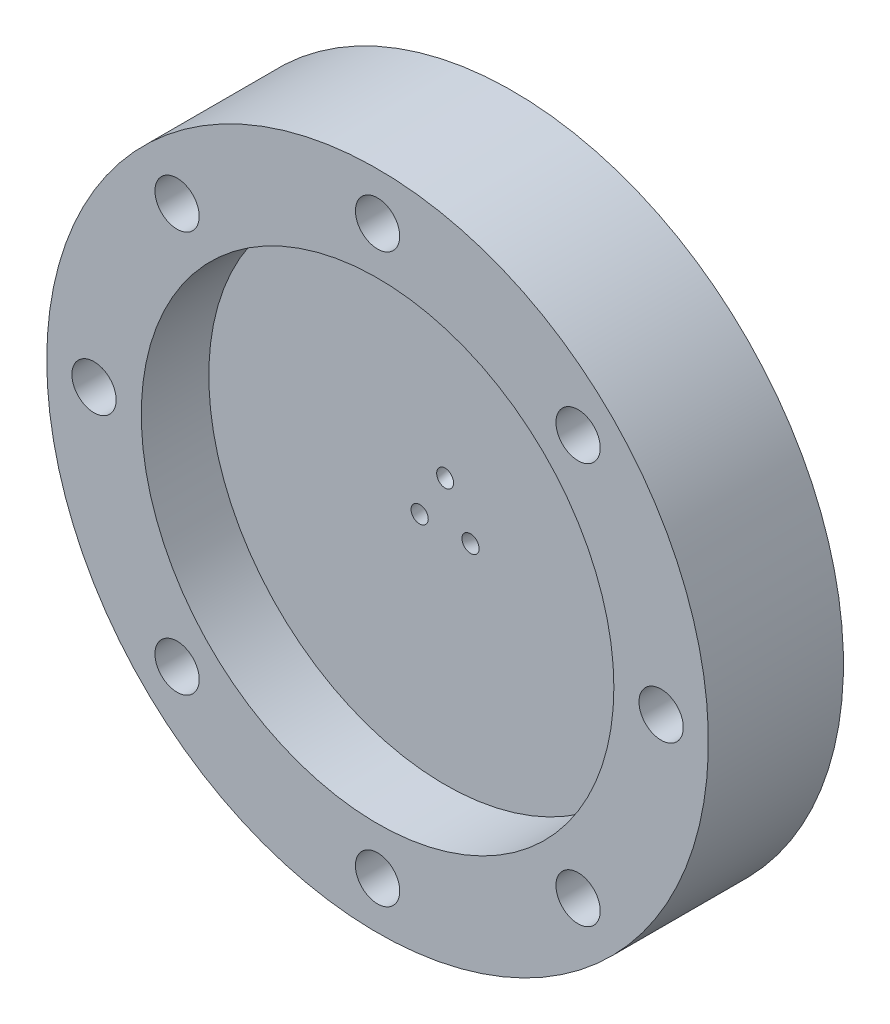
ISO-10303-21;
HEADER;
FILE_DESCRIPTION(('STEP AP214'),'2;1');
FILE_NAME('part.step','',(''),(''),'','','');
FILE_SCHEMA(('AUTOMOTIVE_DESIGN { 1 0 10303 214 1 1 1 1 }'));
ENDSEC;
DATA;
#1=APPLICATION_CONTEXT('core data for automotive mechanical design processes');
#2=APPLICATION_PROTOCOL_DEFINITION('international standard','automotive_design',2000,#1);
#3=PRODUCT_CONTEXT('',#1,'mechanical');
#4=PRODUCT('Part','Part','',(#3));
#5=PRODUCT_RELATED_PRODUCT_CATEGORY('part','',(#4));
#6=PRODUCT_DEFINITION_FORMATION('','',#4);
#7=PRODUCT_DEFINITION_CONTEXT('part definition',#1,'design');
#8=PRODUCT_DEFINITION('design','',#6,#7);
#9=PRODUCT_DEFINITION_SHAPE('','',#8);
#10=(LENGTH_UNIT() NAMED_UNIT(*) SI_UNIT(.MILLI.,.METRE.));
#11=(NAMED_UNIT(*) PLANE_ANGLE_UNIT() SI_UNIT($,.RADIAN.));
#12=(NAMED_UNIT(*) SI_UNIT($,.STERADIAN.) SOLID_ANGLE_UNIT());
#13=UNCERTAINTY_MEASURE_WITH_UNIT(LENGTH_MEASURE(1.E-05),#10,'distance_accuracy_value','');
#14=(GEOMETRIC_REPRESENTATION_CONTEXT(3) GLOBAL_UNCERTAINTY_ASSIGNED_CONTEXT((#13)) GLOBAL_UNIT_ASSIGNED_CONTEXT((#10,
#11,#12)) REPRESENTATION_CONTEXT('',''));
#15=CARTESIAN_POINT('',(0.,0.,0.));
#16=DIRECTION('',(0.,0.,1.));
#17=DIRECTION('',(1.,0.,0.));
#18=AXIS2_PLACEMENT_3D('',#15,#16,#17);
#19=CARTESIAN_POINT('',(0.,0.,-14.413089350023));
#20=DIRECTION('',(0.,0.,1.));
#21=DIRECTION('',(1.,0.,0.));
#22=AXIS2_PLACEMENT_3D('',#19,#20,#21);
#23=CYLINDRICAL_SURFACE('',#22,31.115);
#24=CARTESIAN_POINT('',(0.,0.,-14.413089350023));
#25=DIRECTION('',(0.,0.,-1.));
#26=DIRECTION('',(-1.,0.,0.));
#27=AXIS2_PLACEMENT_3D('',#24,#25,#26);
#28=CIRCLE('',#27,31.115);
#29=CARTESIAN_POINT('',(-31.115,0.,-14.413089350023));
#30=VERTEX_POINT('',#29);
#31=EDGE_CURVE('E10',#30,#30,#28,.T.);
#32=ORIENTED_EDGE('',*,*,#31,.F.);
#33=EDGE_LOOP('',(#32));
#34=FACE_BOUND('',#33,.T.);
#35=CARTESIAN_POINT('',(0.,0.,-1.71308935002297));
#36=DIRECTION('',(0.,0.,-1.));
#37=DIRECTION('',(-1.,0.,0.));
#38=AXIS2_PLACEMENT_3D('',#35,#36,#37);
#39=CIRCLE('',#38,31.115);
#40=CARTESIAN_POINT('',(-31.115,0.,-1.71308935002297));
#41=VERTEX_POINT('',#40);
#42=EDGE_CURVE('E43',#41,#41,#39,.T.);
#43=ORIENTED_EDGE('',*,*,#42,.T.);
#44=EDGE_LOOP('',(#43));
#45=FACE_BOUND('',#44,.T.);
#46=ADVANCED_FACE('F40',(#34,#45),#23,.T.);
#47=CARTESIAN_POINT('',(0.,0.,-14.413089350023));
#48=DIRECTION('',(0.,0.,-1.));
#49=DIRECTION('',(-1.,0.,0.));
#50=AXIS2_PLACEMENT_3D('',#47,#48,#49);
#51=PLANE('',#50);
#52=CARTESIAN_POINT('',(0.,0.,-14.413089350023));
#53=DIRECTION('',(0.,0.,1.));
#54=DIRECTION('',(1.,0.,0.));
#55=AXIS2_PLACEMENT_3D('',#52,#53,#54);
#56=CIRCLE('',#55,2.08279999999999);
#57=CARTESIAN_POINT('',(2.08279999999999,0.,-14.413089350023));
#58=VERTEX_POINT('',#57);
#59=EDGE_CURVE('E114',#58,#58,#56,.T.);
#60=ORIENTED_EDGE('',*,*,#59,.T.);
#61=EDGE_LOOP('',(#60));
#62=FACE_BOUND('',#61,.T.);
#63=CARTESIAN_POINT('',(0.,26.67,-14.413089350023));
#64=DIRECTION('',(0.,0.,-1.));
#65=DIRECTION('',(-1.,0.,0.));
#66=AXIS2_PLACEMENT_3D('',#63,#64,#65);
#67=CIRCLE('',#66,2.0828);
#68=CARTESIAN_POINT('',(-2.0828,26.67,-14.413089350023));
#69=VERTEX_POINT('',#68);
#70=EDGE_CURVE('E93',#69,#69,#67,.T.);
#71=ORIENTED_EDGE('',*,*,#70,.F.);
#72=EDGE_LOOP('',(#71));
#73=FACE_BOUND('',#72,.T.);
#74=CARTESIAN_POINT('',(-18.8585378542452,18.8585378542452,-14.413089350023));
#75=DIRECTION('',(0.,0.,-1.));
#76=DIRECTION('',(-1.,0.,0.));
#77=AXIS2_PLACEMENT_3D('',#74,#75,#76);
#78=CIRCLE('',#77,2.0828);
#79=CARTESIAN_POINT('',(-20.9413378542452,18.8585378542452,-14.413089350023));
#80=VERTEX_POINT('',#79);
#81=EDGE_CURVE('E90',#80,#80,#78,.T.);
#82=ORIENTED_EDGE('',*,*,#81,.F.);
#83=EDGE_LOOP('',(#82));
#84=FACE_BOUND('',#83,.T.);
#85=CARTESIAN_POINT('',(-26.67,0.,-14.413089350023));
#86=DIRECTION('',(0.,0.,-1.));
#87=DIRECTION('',(-1.,0.,0.));
#88=AXIS2_PLACEMENT_3D('',#85,#86,#87);
#89=CIRCLE('',#88,2.0828);
#90=CARTESIAN_POINT('',(-28.7528,0.,-14.413089350023));
#91=VERTEX_POINT('',#90);
#92=EDGE_CURVE('E84',#91,#91,#89,.T.);
#93=ORIENTED_EDGE('',*,*,#92,.F.);
#94=EDGE_LOOP('',(#93));
#95=FACE_BOUND('',#94,.T.);
#96=CARTESIAN_POINT('',(-18.8585378542452,-18.8585378542452,-14.413089350023));
#97=DIRECTION('',(0.,0.,-1.));
#98=DIRECTION('',(-1.,0.,0.));
#99=AXIS2_PLACEMENT_3D('',#96,#97,#98);
#100=CIRCLE('',#99,2.0828);
#101=CARTESIAN_POINT('',(-20.9413378542452,-18.8585378542452,-14.413089350023));
#102=VERTEX_POINT('',#101);
#103=EDGE_CURVE('E78',#102,#102,#100,.T.);
#104=ORIENTED_EDGE('',*,*,#103,.F.);
#105=EDGE_LOOP('',(#104));
#106=FACE_BOUND('',#105,.T.);
#107=CARTESIAN_POINT('',(0.,-26.67,-14.413089350023));
#108=DIRECTION('',(0.,0.,-1.));
#109=DIRECTION('',(-1.,0.,0.));
#110=AXIS2_PLACEMENT_3D('',#107,#108,#109);
#111=CIRCLE('',#110,2.0828);
#112=CARTESIAN_POINT('',(-2.08280000000001,-26.67,-14.413089350023));
#113=VERTEX_POINT('',#112);
#114=EDGE_CURVE('E72',#113,#113,#111,.T.);
#115=ORIENTED_EDGE('',*,*,#114,.F.);
#116=EDGE_LOOP('',(#115));
#117=FACE_BOUND('',#116,.T.);
#118=CARTESIAN_POINT('',(18.8585378542452,-18.8585378542452,-14.413089350023));
#119=DIRECTION('',(0.,0.,-1.));
#120=DIRECTION('',(-1.,0.,0.));
#121=AXIS2_PLACEMENT_3D('',#118,#119,#120);
#122=CIRCLE('',#121,2.0828);
#123=CARTESIAN_POINT('',(16.7757378542452,-18.8585378542452,-14.413089350023));
#124=VERTEX_POINT('',#123);
#125=EDGE_CURVE('E66',#124,#124,#122,.T.);
#126=ORIENTED_EDGE('',*,*,#125,.F.);
#127=EDGE_LOOP('',(#126));
#128=FACE_BOUND('',#127,.T.);
#129=CARTESIAN_POINT('',(26.67,0.,-14.413089350023));
#130=DIRECTION('',(0.,0.,-1.));
#131=DIRECTION('',(-1.,0.,0.));
#132=AXIS2_PLACEMENT_3D('',#129,#130,#131);
#133=CIRCLE('',#132,2.0828);
#134=CARTESIAN_POINT('',(24.5872,0.,-14.413089350023));
#135=VERTEX_POINT('',#134);
#136=EDGE_CURVE('E60',#135,#135,#133,.T.);
#137=ORIENTED_EDGE('',*,*,#136,.F.);
#138=EDGE_LOOP('',(#137));
#139=FACE_BOUND('',#138,.T.);
#140=CARTESIAN_POINT('',(18.8585378542452,18.8585378542452,-14.413089350023));
#141=DIRECTION('',(0.,0.,-1.));
#142=DIRECTION('',(-1.,0.,0.));
#143=AXIS2_PLACEMENT_3D('',#140,#141,#142);
#144=CIRCLE('',#143,2.0828);
#145=CARTESIAN_POINT('',(16.7757378542452,18.8585378542452,-14.413089350023));
#146=VERTEX_POINT('',#145);
#147=EDGE_CURVE('E52',#146,#146,#144,.T.);
#148=ORIENTED_EDGE('',*,*,#147,.F.);
#149=EDGE_LOOP('',(#148));
#150=FACE_BOUND('',#149,.T.);
#151=ORIENTED_EDGE('',*,*,#31,.T.);
#152=EDGE_LOOP('',(#151));
#153=FACE_BOUND('',#152,.T.);
#154=ADVANCED_FACE('F155',(#62,#73,#84,#95,#106,#117,#128,#139,#150,#153),#51,.T.);
#155=CARTESIAN_POINT('',(0.,0.,-1.71308935002297));
#156=DIRECTION('',(0.,0.,-1.));
#157=DIRECTION('',(-1.,0.,0.));
#158=AXIS2_PLACEMENT_3D('',#155,#156,#157);
#159=PLANE('',#158);
#160=CARTESIAN_POINT('',(0.,0.,-1.71308935002297));
#161=DIRECTION('',(0.,0.,1.));
#162=DIRECTION('',(1.,0.,0.));
#163=AXIS2_PLACEMENT_3D('',#160,#161,#162);
#164=CIRCLE('',#163,22.225);
#165=CARTESIAN_POINT('',(22.225,0.,-1.71308935002297));
#166=VERTEX_POINT('',#165);
#167=EDGE_CURVE('E100',#166,#166,#164,.T.);
#168=ORIENTED_EDGE('',*,*,#167,.F.);
#169=EDGE_LOOP('',(#168));
#170=FACE_BOUND('',#169,.T.);
#171=CARTESIAN_POINT('',(0.,26.67,-1.71308935002297));
#172=DIRECTION('',(0.,0.,-1.));
#173=DIRECTION('',(-1.,0.,0.));
#174=AXIS2_PLACEMENT_3D('',#171,#172,#173);
#175=CIRCLE('',#174,2.0828);
#176=CARTESIAN_POINT('',(-2.0828,26.67,-1.71308935002297));
#177=VERTEX_POINT('',#176);
#178=EDGE_CURVE('E50',#177,#177,#175,.F.);
#179=ORIENTED_EDGE('',*,*,#178,.F.);
#180=EDGE_LOOP('',(#179));
#181=FACE_BOUND('',#180,.T.);
#182=CARTESIAN_POINT('',(-18.8585378542452,18.8585378542452,-1.71308935002297));
#183=DIRECTION('',(0.,0.,-1.));
#184=DIRECTION('',(-1.,0.,0.));
#185=AXIS2_PLACEMENT_3D('',#182,#183,#184);
#186=CIRCLE('',#185,2.0828);
#187=CARTESIAN_POINT('',(-20.9413378542452,18.8585378542452,-1.71308935002297));
#188=VERTEX_POINT('',#187);
#189=EDGE_CURVE('E87',#188,#188,#186,.F.);
#190=ORIENTED_EDGE('',*,*,#189,.F.);
#191=EDGE_LOOP('',(#190));
#192=FACE_BOUND('',#191,.T.);
#193=CARTESIAN_POINT('',(-26.67,0.,-1.71308935002297));
#194=DIRECTION('',(0.,0.,-1.));
#195=DIRECTION('',(-1.,0.,0.));
#196=AXIS2_PLACEMENT_3D('',#193,#194,#195);
#197=CIRCLE('',#196,2.0828);
#198=CARTESIAN_POINT('',(-28.7528,0.,-1.71308935002297));
#199=VERTEX_POINT('',#198);
#200=EDGE_CURVE('E81',#199,#199,#197,.F.);
#201=ORIENTED_EDGE('',*,*,#200,.F.);
#202=EDGE_LOOP('',(#201));
#203=FACE_BOUND('',#202,.T.);
#204=CARTESIAN_POINT('',(-18.8585378542452,-18.8585378542452,-1.71308935002297));
#205=DIRECTION('',(0.,0.,-1.));
#206=DIRECTION('',(-1.,0.,0.));
#207=AXIS2_PLACEMENT_3D('',#204,#205,#206);
#208=CIRCLE('',#207,2.0828);
#209=CARTESIAN_POINT('',(-20.9413378542452,-18.8585378542452,-1.71308935002297));
#210=VERTEX_POINT('',#209);
#211=EDGE_CURVE('E75',#210,#210,#208,.F.);
#212=ORIENTED_EDGE('',*,*,#211,.F.);
#213=EDGE_LOOP('',(#212));
#214=FACE_BOUND('',#213,.T.);
#215=CARTESIAN_POINT('',(0.,-26.67,-1.71308935002297));
#216=DIRECTION('',(0.,0.,-1.));
#217=DIRECTION('',(-1.,0.,0.));
#218=AXIS2_PLACEMENT_3D('',#215,#216,#217);
#219=CIRCLE('',#218,2.0828);
#220=CARTESIAN_POINT('',(-2.08280000000001,-26.67,-1.71308935002297));
#221=VERTEX_POINT('',#220);
#222=EDGE_CURVE('E69',#221,#221,#219,.F.);
#223=ORIENTED_EDGE('',*,*,#222,.F.);
#224=EDGE_LOOP('',(#223));
#225=FACE_BOUND('',#224,.T.);
#226=CARTESIAN_POINT('',(18.8585378542452,-18.8585378542452,-1.71308935002297));
#227=DIRECTION('',(0.,0.,-1.));
#228=DIRECTION('',(-1.,0.,0.));
#229=AXIS2_PLACEMENT_3D('',#226,#227,#228);
#230=CIRCLE('',#229,2.0828);
#231=CARTESIAN_POINT('',(16.7757378542452,-18.8585378542452,-1.71308935002297));
#232=VERTEX_POINT('',#231);
#233=EDGE_CURVE('E63',#232,#232,#230,.F.);
#234=ORIENTED_EDGE('',*,*,#233,.F.);
#235=EDGE_LOOP('',(#234));
#236=FACE_BOUND('',#235,.T.);
#237=CARTESIAN_POINT('',(26.67,0.,-1.71308935002297));
#238=DIRECTION('',(0.,0.,-1.));
#239=DIRECTION('',(-1.,0.,0.));
#240=AXIS2_PLACEMENT_3D('',#237,#238,#239);
#241=CIRCLE('',#240,2.0828);
#242=CARTESIAN_POINT('',(24.5872,0.,-1.71308935002297));
#243=VERTEX_POINT('',#242);
#244=EDGE_CURVE('E55',#243,#243,#241,.F.);
#245=ORIENTED_EDGE('',*,*,#244,.F.);
#246=EDGE_LOOP('',(#245));
#247=FACE_BOUND('',#246,.T.);
#248=CARTESIAN_POINT('',(18.8585378542452,18.8585378542452,-1.71308935002297));
#249=DIRECTION('',(0.,0.,-1.));
#250=DIRECTION('',(-1.,0.,0.));
#251=AXIS2_PLACEMENT_3D('',#248,#249,#250);
#252=CIRCLE('',#251,2.0828);
#253=CARTESIAN_POINT('',(16.7757378542452,18.8585378542452,-1.71308935002297));
#254=VERTEX_POINT('',#253);
#255=EDGE_CURVE('E56',#254,#254,#252,.F.);
#256=ORIENTED_EDGE('',*,*,#255,.F.);
#257=EDGE_LOOP('',(#256));
#258=FACE_BOUND('',#257,.T.);
#259=ORIENTED_EDGE('',*,*,#42,.F.);
#260=EDGE_LOOP('',(#259));
#261=FACE_BOUND('',#260,.T.);
#262=ADVANCED_FACE('F160',(#170,#181,#192,#203,#214,#225,#236,#247,#258,#261),#159,.F.);
#263=CARTESIAN_POINT('',(18.8585378542452,18.8585378542452,4.1779586653984));
#264=DIRECTION('',(0.,0.,-1.));
#265=DIRECTION('',(-1.,0.,0.));
#266=AXIS2_PLACEMENT_3D('',#263,#264,#265);
#267=CYLINDRICAL_SURFACE('',#266,2.0828);
#268=ORIENTED_EDGE('',*,*,#255,.T.);
#269=EDGE_LOOP('',(#268));
#270=FACE_BOUND('',#269,.T.);
#271=ORIENTED_EDGE('',*,*,#147,.T.);
#272=EDGE_LOOP('',(#271));
#273=FACE_BOUND('',#272,.T.);
#274=ADVANCED_FACE('F167',(#270,#273),#267,.F.);
#275=CARTESIAN_POINT('',(26.67,0.,4.1779586653984));
#276=DIRECTION('',(0.,0.,-1.));
#277=DIRECTION('',(-1.,0.,0.));
#278=AXIS2_PLACEMENT_3D('',#275,#276,#277);
#279=CYLINDRICAL_SURFACE('',#278,2.0828);
#280=ORIENTED_EDGE('',*,*,#244,.T.);
#281=EDGE_LOOP('',(#280));
#282=FACE_BOUND('',#281,.T.);
#283=ORIENTED_EDGE('',*,*,#136,.T.);
#284=EDGE_LOOP('',(#283));
#285=FACE_BOUND('',#284,.T.);
#286=ADVANCED_FACE('F172',(#282,#285),#279,.F.);
#287=CARTESIAN_POINT('',(18.8585378542452,-18.8585378542452,4.1779586653984));
#288=DIRECTION('',(0.,0.,-1.));
#289=DIRECTION('',(-1.,0.,0.));
#290=AXIS2_PLACEMENT_3D('',#287,#288,#289);
#291=CYLINDRICAL_SURFACE('',#290,2.0828);
#292=ORIENTED_EDGE('',*,*,#233,.T.);
#293=EDGE_LOOP('',(#292));
#294=FACE_BOUND('',#293,.T.);
#295=ORIENTED_EDGE('',*,*,#125,.T.);
#296=EDGE_LOOP('',(#295));
#297=FACE_BOUND('',#296,.T.);
#298=ADVANCED_FACE('F180',(#294,#297),#291,.F.);
#299=CARTESIAN_POINT('',(0.,-26.67,4.1779586653984));
#300=DIRECTION('',(0.,0.,-1.));
#301=DIRECTION('',(-1.,0.,0.));
#302=AXIS2_PLACEMENT_3D('',#299,#300,#301);
#303=CYLINDRICAL_SURFACE('',#302,2.0828);
#304=ORIENTED_EDGE('',*,*,#222,.T.);
#305=EDGE_LOOP('',(#304));
#306=FACE_BOUND('',#305,.T.);
#307=ORIENTED_EDGE('',*,*,#114,.T.);
#308=EDGE_LOOP('',(#307));
#309=FACE_BOUND('',#308,.T.);
#310=ADVANCED_FACE('F184',(#306,#309),#303,.F.);
#311=CARTESIAN_POINT('',(-18.8585378542452,-18.8585378542452,4.1779586653984));
#312=DIRECTION('',(0.,0.,-1.));
#313=DIRECTION('',(-1.,0.,0.));
#314=AXIS2_PLACEMENT_3D('',#311,#312,#313);
#315=CYLINDRICAL_SURFACE('',#314,2.0828);
#316=ORIENTED_EDGE('',*,*,#211,.T.);
#317=EDGE_LOOP('',(#316));
#318=FACE_BOUND('',#317,.T.);
#319=ORIENTED_EDGE('',*,*,#103,.T.);
#320=EDGE_LOOP('',(#319));
#321=FACE_BOUND('',#320,.T.);
#322=ADVANCED_FACE('F188',(#318,#321),#315,.F.);
#323=CARTESIAN_POINT('',(-26.67,0.,4.1779586653984));
#324=DIRECTION('',(0.,0.,-1.));
#325=DIRECTION('',(-1.,0.,0.));
#326=AXIS2_PLACEMENT_3D('',#323,#324,#325);
#327=CYLINDRICAL_SURFACE('',#326,2.0828);
#328=ORIENTED_EDGE('',*,*,#200,.T.);
#329=EDGE_LOOP('',(#328));
#330=FACE_BOUND('',#329,.T.);
#331=ORIENTED_EDGE('',*,*,#92,.T.);
#332=EDGE_LOOP('',(#331));
#333=FACE_BOUND('',#332,.T.);
#334=ADVANCED_FACE('F192',(#330,#333),#327,.F.);
#335=CARTESIAN_POINT('',(-18.8585378542452,18.8585378542452,4.1779586653984));
#336=DIRECTION('',(0.,0.,-1.));
#337=DIRECTION('',(-1.,0.,0.));
#338=AXIS2_PLACEMENT_3D('',#335,#336,#337);
#339=CYLINDRICAL_SURFACE('',#338,2.0828);
#340=ORIENTED_EDGE('',*,*,#189,.T.);
#341=EDGE_LOOP('',(#340));
#342=FACE_BOUND('',#341,.T.);
#343=ORIENTED_EDGE('',*,*,#81,.T.);
#344=EDGE_LOOP('',(#343));
#345=FACE_BOUND('',#344,.T.);
#346=ADVANCED_FACE('F196',(#342,#345),#339,.F.);
#347=CARTESIAN_POINT('',(0.,26.67,4.1779586653984));
#348=DIRECTION('',(0.,0.,-1.));
#349=DIRECTION('',(-1.,0.,0.));
#350=AXIS2_PLACEMENT_3D('',#347,#348,#349);
#351=CYLINDRICAL_SURFACE('',#350,2.0828);
#352=ORIENTED_EDGE('',*,*,#178,.T.);
#353=EDGE_LOOP('',(#352));
#354=FACE_BOUND('',#353,.T.);
#355=ORIENTED_EDGE('',*,*,#70,.T.);
#356=EDGE_LOOP('',(#355));
#357=FACE_BOUND('',#356,.T.);
#358=ADVANCED_FACE('F200',(#354,#357),#351,.F.);
#359=CARTESIAN_POINT('',(0.,0.,-8.06308935002297));
#360=DIRECTION('',(0.,0.,1.));
#361=DIRECTION('',(1.,0.,0.));
#362=AXIS2_PLACEMENT_3D('',#359,#360,#361);
#363=CYLINDRICAL_SURFACE('',#362,22.225);
#364=CARTESIAN_POINT('',(0.,0.,-8.06308935002297));
#365=DIRECTION('',(0.,0.,1.));
#366=DIRECTION('',(1.,0.,0.));
#367=AXIS2_PLACEMENT_3D('',#364,#365,#366);
#368=CIRCLE('',#367,22.225);
#369=CARTESIAN_POINT('',(22.225,0.,-8.06308935002297));
#370=VERTEX_POINT('',#369);
#371=EDGE_CURVE('E59',#370,#370,#368,.T.);
#372=ORIENTED_EDGE('',*,*,#371,.F.);
#373=EDGE_LOOP('',(#372));
#374=FACE_BOUND('',#373,.T.);
#375=ORIENTED_EDGE('',*,*,#167,.T.);
#376=EDGE_LOOP('',(#375));
#377=FACE_BOUND('',#376,.T.);
#378=ADVANCED_FACE('F204',(#374,#377),#363,.F.);
#379=CARTESIAN_POINT('',(0.,0.,-8.06308935002297));
#380=DIRECTION('',(0.,0.,1.));
#381=DIRECTION('',(1.,0.,0.));
#382=AXIS2_PLACEMENT_3D('',#379,#380,#381);
#383=PLANE('',#382);
#384=CARTESIAN_POINT('',(-2.39098318001355,-1.38043478260871,-8.06308935002297));
#385=DIRECTION('',(0.,0.,1.));
#386=DIRECTION('',(0.866025403784436,0.500000000000004,0.));
#387=AXIS2_PLACEMENT_3D('',#384,#385,#386);
#388=ELLIPSE('',#387,0.812289397600194,0.79375);
#389=CARTESIAN_POINT('',(-1.68751992646703,-0.974290083808606,-8.06308935002297));
#390=VERTEX_POINT('',#389);
#391=EDGE_CURVE('E123',#390,#390,#388,.T.);
#392=ORIENTED_EDGE('',*,*,#391,.F.);
#393=EDGE_LOOP('',(#392));
#394=FACE_BOUND('',#393,.T.);
#395=CARTESIAN_POINT('',(2.39098318001357,-1.38043478260867,-8.06308935002297));
#396=DIRECTION('',(0.,0.,1.));
#397=DIRECTION('',(-0.866025403784443,0.499999999999992,0.));
#398=AXIS2_PLACEMENT_3D('',#395,#396,#397);
#399=ELLIPSE('',#398,0.812289397600194,0.79375);
#400=CARTESIAN_POINT('',(1.68751992646704,-0.974290083808583,-8.06308935002297));
#401=VERTEX_POINT('',#400);
#402=EDGE_CURVE('E126',#401,#401,#399,.T.);
#403=ORIENTED_EDGE('',*,*,#402,.F.);
#404=EDGE_LOOP('',(#403));
#405=FACE_BOUND('',#404,.T.);
#406=CARTESIAN_POINT('',(0.,2.76086956521739,-8.06308935002297));
#407=DIRECTION('',(0.,0.,1.));
#408=DIRECTION('',(0.,-1.,0.));
#409=AXIS2_PLACEMENT_3D('',#406,#407,#408);
#410=ELLIPSE('',#409,0.812289397600194,0.79375);
#411=CARTESIAN_POINT('',(0.,1.9485801676172,-8.06308935002297));
#412=VERTEX_POINT('',#411);
#413=EDGE_CURVE('E117',#412,#412,#410,.T.);
#414=ORIENTED_EDGE('',*,*,#413,.F.);
#415=EDGE_LOOP('',(#414));
#416=FACE_BOUND('',#415,.T.);
#417=ORIENTED_EDGE('',*,*,#371,.T.);
#418=EDGE_LOOP('',(#417));
#419=FACE_BOUND('',#418,.T.);
#420=ADVANCED_FACE('F208',(#394,#405,#416,#419),#383,.T.);
#421=CARTESIAN_POINT('',(0.,0.,-9.96808935002297));
#422=DIRECTION('',(0.,0.,-1.));
#423=DIRECTION('',(-1.,0.,0.));
#424=AXIS2_PLACEMENT_3D('',#421,#422,#423);
#425=PLANE('',#424);
#426=CARTESIAN_POINT('',(-2.74963065701558,-1.58750000000001,-9.96808935002297));
#427=DIRECTION('',(0.,0.,-1.));
#428=DIRECTION('',(0.866025403784436,0.500000000000004,0.));
#429=AXIS2_PLACEMENT_3D('',#426,#427,#428);
#430=ELLIPSE('',#429,0.812289397600194,0.79375);
#431=CARTESIAN_POINT('',(-2.04616740346906,-1.18135530119991,-9.96808935002297));
#432=VERTEX_POINT('',#431);
#433=EDGE_CURVE('E129',#432,#432,#430,.F.);
#434=ORIENTED_EDGE('',*,*,#433,.T.);
#435=EDGE_LOOP('',(#434));
#436=FACE_BOUND('',#435,.T.);
#437=CARTESIAN_POINT('',(2.74963065701561,-1.58749999999997,-9.96808935002297));
#438=DIRECTION('',(0.,0.,-1.));
#439=DIRECTION('',(-0.866025403784443,0.499999999999992,0.));
#440=AXIS2_PLACEMENT_3D('',#437,#438,#439);
#441=ELLIPSE('',#440,0.812289397600194,0.79375);
#442=CARTESIAN_POINT('',(2.04616740346908,-1.18135530119988,-9.96808935002297));
#443=VERTEX_POINT('',#442);
#444=EDGE_CURVE('E132',#443,#443,#441,.F.);
#445=ORIENTED_EDGE('',*,*,#444,.T.);
#446=EDGE_LOOP('',(#445));
#447=FACE_BOUND('',#446,.T.);
#448=CARTESIAN_POINT('',(0.,3.175,-9.96808935002297));
#449=DIRECTION('',(0.,0.,-1.));
#450=DIRECTION('',(0.,-1.,0.));
#451=AXIS2_PLACEMENT_3D('',#448,#449,#450);
#452=ELLIPSE('',#451,0.812289397600194,0.79375);
#453=CARTESIAN_POINT('',(0.,2.36271060239981,-9.96808935002297));
#454=VERTEX_POINT('',#453);
#455=EDGE_CURVE('E120',#454,#454,#452,.F.);
#456=ORIENTED_EDGE('',*,*,#455,.T.);
#457=EDGE_LOOP('',(#456));
#458=FACE_BOUND('',#457,.T.);
#459=CARTESIAN_POINT('',(0.,0.,-9.96808935002297));
#460=DIRECTION('',(0.,0.,1.));
#461=DIRECTION('',(1.,0.,0.));
#462=AXIS2_PLACEMENT_3D('',#459,#460,#461);
#463=CIRCLE('',#462,6.35);
#464=CARTESIAN_POINT('',(6.35,0.,-9.96808935002297));
#465=VERTEX_POINT('',#464);
#466=EDGE_CURVE('E103',#465,#465,#463,.T.);
#467=ORIENTED_EDGE('',*,*,#466,.F.);
#468=EDGE_LOOP('',(#467));
#469=FACE_BOUND('',#468,.T.);
#470=ADVANCED_FACE('F136',(#436,#447,#458,#469),#425,.T.);
#471=CARTESIAN_POINT('',(0.,0.,69.0368334316807));
#472=DIRECTION('',(0.,0.,1.));
#473=DIRECTION('',(1.,0.,0.));
#474=AXIS2_PLACEMENT_3D('',#471,#472,#473);
#475=CYLINDRICAL_SURFACE('',#474,6.35);
#476=ORIENTED_EDGE('',*,*,#466,.T.);
#477=EDGE_LOOP('',(#476));
#478=FACE_BOUND('',#477,.T.);
#479=CARTESIAN_POINT('',(0.,0.,-12.508089350023));
#480=DIRECTION('',(0.,0.,1.));
#481=DIRECTION('',(1.,0.,0.));
#482=AXIS2_PLACEMENT_3D('',#479,#480,#481);
#483=CIRCLE('',#482,6.35);
#484=CARTESIAN_POINT('',(6.35,0.,-12.508089350023));
#485=VERTEX_POINT('',#484);
#486=EDGE_CURVE('E108',#485,#485,#483,.T.);
#487=ORIENTED_EDGE('',*,*,#486,.F.);
#488=EDGE_LOOP('',(#487));
#489=FACE_BOUND('',#488,.T.);
#490=ADVANCED_FACE('F215',(#478,#489),#475,.F.);
#491=CARTESIAN_POINT('',(0.,6.35,-12.508089350023));
#492=DIRECTION('',(0.,0.,1.));
#493=DIRECTION('',(1.,0.,0.));
#494=AXIS2_PLACEMENT_3D('',#491,#492,#493);
#495=PLANE('',#494);
#496=ORIENTED_EDGE('',*,*,#486,.T.);
#497=EDGE_LOOP('',(#496));
#498=FACE_BOUND('',#497,.T.);
#499=CARTESIAN_POINT('',(0.,0.,-12.508089350023));
#500=DIRECTION('',(0.,0.,1.));
#501=DIRECTION('',(1.,0.,0.));
#502=AXIS2_PLACEMENT_3D('',#499,#500,#501);
#503=CIRCLE('',#502,2.08279999999999);
#504=CARTESIAN_POINT('',(2.08279999999999,0.,-12.508089350023));
#505=VERTEX_POINT('',#504);
#506=EDGE_CURVE('E111',#505,#505,#503,.T.);
#507=ORIENTED_EDGE('',*,*,#506,.F.);
#508=EDGE_LOOP('',(#507));
#509=FACE_BOUND('',#508,.T.);
#510=ADVANCED_FACE('F219',(#498,#509),#495,.T.);
#511=CARTESIAN_POINT('',(0.,0.,69.0368334316807));
#512=DIRECTION('',(0.,0.,1.));
#513=DIRECTION('',(1.,0.,0.));
#514=AXIS2_PLACEMENT_3D('',#511,#512,#513);
#515=CYLINDRICAL_SURFACE('',#514,2.08279999999999);
#516=ORIENTED_EDGE('',*,*,#506,.T.);
#517=EDGE_LOOP('',(#516));
#518=FACE_BOUND('',#517,.T.);
#519=ORIENTED_EDGE('',*,*,#59,.F.);
#520=EDGE_LOOP('',(#519));
#521=FACE_BOUND('',#520,.T.);
#522=ADVANCED_FACE('F151',(#518,#521),#515,.F.);
#523=CARTESIAN_POINT('',(0.,3.65748777566715,-12.1875331180918));
#524=DIRECTION('',(0.,-0.212429644331044,0.977176363922801));
#525=DIRECTION('',(0.,-0.977176363922801,-0.212429644331044));
#526=AXIS2_PLACEMENT_3D('',#523,#524,#525);
#527=CYLINDRICAL_SURFACE('',#526,0.79375);
#528=ORIENTED_EDGE('',*,*,#413,.T.);
#529=EDGE_LOOP('',(#528));
#530=FACE_BOUND('',#529,.T.);
#531=ORIENTED_EDGE('',*,*,#455,.F.);
#532=EDGE_LOOP('',(#531));
#533=FACE_BOUND('',#532,.T.);
#534=ADVANCED_FACE('F142',(#530,#533),#527,.F.);
#535=CARTESIAN_POINT('',(3.16747732775881,-1.82874388783354,-12.1875331180918));
#536=DIRECTION('',(-0.183969468507578,0.10621482216552,0.977176363922801));
#537=DIRECTION('',(0.982735496064899,0.,0.185016066259328));
#538=AXIS2_PLACEMENT_3D('',#535,#536,#537);
#539=CYLINDRICAL_SURFACE('',#538,0.79375);
#540=ORIENTED_EDGE('',*,*,#402,.T.);
#541=EDGE_LOOP('',(#540));
#542=FACE_BOUND('',#541,.T.);
#543=ORIENTED_EDGE('',*,*,#444,.F.);
#544=EDGE_LOOP('',(#543));
#545=FACE_BOUND('',#544,.T.);
#546=ADVANCED_FACE('F139',(#542,#545),#539,.F.);
#547=CARTESIAN_POINT('',(-3.16747732775878,-1.82874388783359,-12.1875331180918));
#548=DIRECTION('',(0.183969468507576,0.106214822165523,0.977176363922801));
#549=DIRECTION('',(0.9827354960649,0.,-0.185016066259327));
#550=AXIS2_PLACEMENT_3D('',#547,#548,#549);
#551=CYLINDRICAL_SURFACE('',#550,0.79375);
#552=ORIENTED_EDGE('',*,*,#391,.T.);
#553=EDGE_LOOP('',(#552));
#554=FACE_BOUND('',#553,.T.);
#555=ORIENTED_EDGE('',*,*,#433,.F.);
#556=EDGE_LOOP('',(#555));
#557=FACE_BOUND('',#556,.T.);
#558=ADVANCED_FACE('F141',(#554,#557),#551,.F.);
#559=CLOSED_SHELL('',(#46,#154,#262,#274,#286,#298,#310,#322,#334,#346,#358,#378,#420,#470,#490,
#510,#522,#534,#546,#558));
#560=MANIFOLD_SOLID_BREP('B2',#559);
#561=ADVANCED_BREP_SHAPE_REPRESENTATION('',(#18,#560),#14);
#562=SHAPE_DEFINITION_REPRESENTATION(#9,#561);
ENDSEC;
END-ISO-10303-21;
